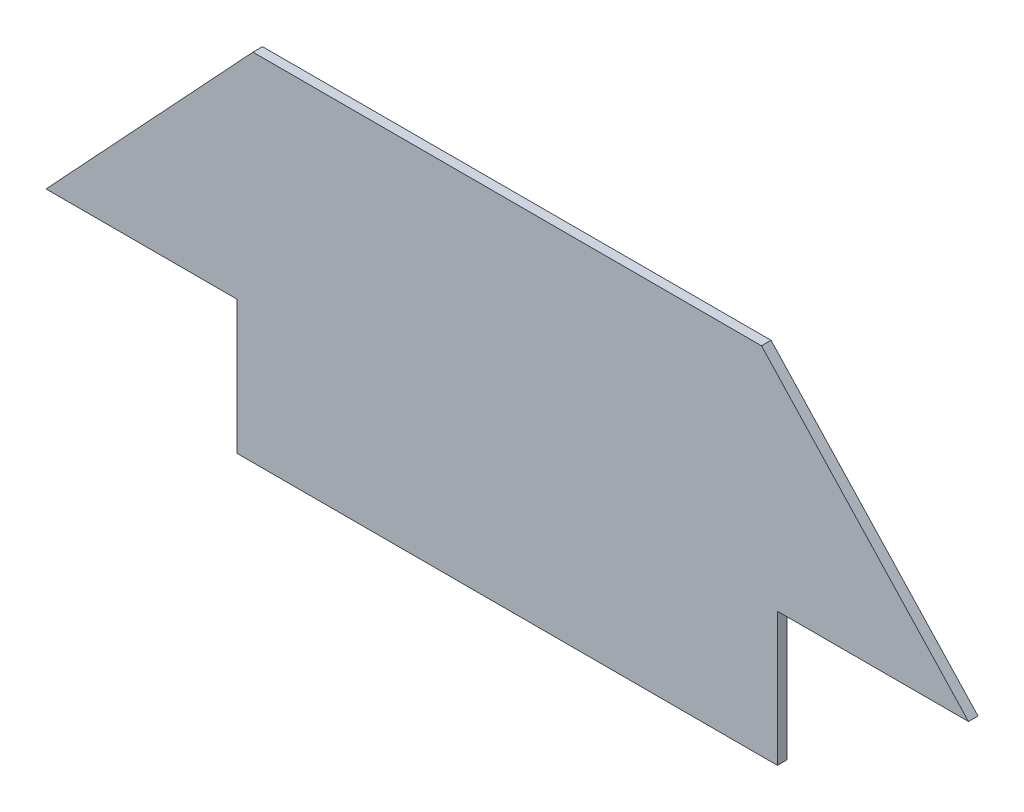
ISO-10303-21;
HEADER;
FILE_DESCRIPTION(('STEP AP214'),'2;1');
FILE_NAME('part.step','',(''),(''),'','','');
FILE_SCHEMA(('AUTOMOTIVE_DESIGN { 1 0 10303 214 1 1 1 1 }'));
ENDSEC;
DATA;
#1=APPLICATION_CONTEXT('core data for automotive mechanical design processes');
#2=APPLICATION_PROTOCOL_DEFINITION('international standard','automotive_design',2000,#1);
#3=PRODUCT_CONTEXT('',#1,'mechanical');
#4=PRODUCT('Part','Part','',(#3));
#5=PRODUCT_RELATED_PRODUCT_CATEGORY('part','',(#4));
#6=PRODUCT_DEFINITION_FORMATION('','',#4);
#7=PRODUCT_DEFINITION_CONTEXT('part definition',#1,'design');
#8=PRODUCT_DEFINITION('design','',#6,#7);
#9=PRODUCT_DEFINITION_SHAPE('','',#8);
#10=(LENGTH_UNIT() NAMED_UNIT(*) SI_UNIT(.MILLI.,.METRE.));
#11=(NAMED_UNIT(*) PLANE_ANGLE_UNIT() SI_UNIT($,.RADIAN.));
#12=(NAMED_UNIT(*) SI_UNIT($,.STERADIAN.) SOLID_ANGLE_UNIT());
#13=UNCERTAINTY_MEASURE_WITH_UNIT(LENGTH_MEASURE(1.E-05),#10,'distance_accuracy_value','');
#14=(GEOMETRIC_REPRESENTATION_CONTEXT(3) GLOBAL_UNCERTAINTY_ASSIGNED_CONTEXT((#13)) GLOBAL_UNIT_ASSIGNED_CONTEXT((#10,
#11,#12)) REPRESENTATION_CONTEXT('',''));
#15=CARTESIAN_POINT('',(0.,0.,0.));
#16=DIRECTION('',(0.,0.,1.));
#17=DIRECTION('',(1.,0.,0.));
#18=AXIS2_PLACEMENT_3D('',#15,#16,#17);
#19=CARTESIAN_POINT('',(0.,0.,3.));
#20=DIRECTION('',(0.,1.,0.));
#21=DIRECTION('',(0.,0.,1.));
#22=AXIS2_PLACEMENT_3D('',#19,#20,#21);
#23=PLANE('',#22);
#24=DIRECTION('',(1.,0.,0.));
#25=VECTOR('',#24,1.);
#26=CARTESIAN_POINT('',(0.,0.,0.));
#27=LINE('',#26,#25);
#28=CARTESIAN_POINT('',(-80.,0.,0.));
#29=VERTEX_POINT('',#28);
#30=CARTESIAN_POINT('',(80.,0.,0.));
#31=VERTEX_POINT('',#30);
#32=EDGE_CURVE('E143',#29,#31,#27,.T.);
#33=ORIENTED_EDGE('',*,*,#32,.F.);
#34=DIRECTION('',(0.,0.,-1.));
#35=VECTOR('',#34,1.);
#36=CARTESIAN_POINT('',(-80.,0.,3.));
#37=LINE('',#36,#35);
#38=CARTESIAN_POINT('',(-80.,0.,3.));
#39=VERTEX_POINT('',#38);
#40=EDGE_CURVE('E11',#39,#29,#37,.T.);
#41=ORIENTED_EDGE('',*,*,#40,.F.);
#42=DIRECTION('',(1.,0.,0.));
#43=VECTOR('',#42,1.);
#44=CARTESIAN_POINT('',(0.,0.,3.));
#45=LINE('',#44,#43);
#46=CARTESIAN_POINT('',(80.,0.,3.));
#47=VERTEX_POINT('',#46);
#48=EDGE_CURVE('E169',#39,#47,#45,.T.);
#49=ORIENTED_EDGE('',*,*,#48,.T.);
#50=DIRECTION('',(0.,0.,-1.));
#51=VECTOR('',#50,1.);
#52=CARTESIAN_POINT('',(80.,0.,3.));
#53=LINE('',#52,#51);
#54=EDGE_CURVE('E62',#47,#31,#53,.T.);
#55=ORIENTED_EDGE('',*,*,#54,.T.);
#56=EDGE_LOOP('',(#33,#41,#49,#55));
#57=FACE_BOUND('',#56,.T.);
#58=ADVANCED_FACE('F45',(#57),#23,.T.);
#59=CARTESIAN_POINT('',(-42.7902589497652,39.902562010393,3.));
#60=DIRECTION('',(0.731353701619172,-0.681998360062497,0.));
#61=DIRECTION('',(0.681998360062497,0.731353701619172,0.));
#62=AXIS2_PLACEMENT_3D('',#59,#60,#61);
#63=PLANE('',#62);
#64=DIRECTION('',(-0.681998360062497,-0.731353701619172,0.));
#65=VECTOR('',#64,1.);
#66=CARTESIAN_POINT('',(-42.7902589497652,39.902562010393,0.));
#67=LINE('',#66,#65);
#68=CARTESIAN_POINT('',(-145.109322536311,-69.8212002188447,0.));
#69=VERTEX_POINT('',#68);
#70=EDGE_CURVE('E146',#29,#69,#67,.T.);
#71=ORIENTED_EDGE('',*,*,#70,.T.);
#72=DIRECTION('',(0.,0.,-1.));
#73=VECTOR('',#72,1.);
#74=CARTESIAN_POINT('',(-145.109322536311,-69.8212002188447,3.));
#75=LINE('',#74,#73);
#76=CARTESIAN_POINT('',(-145.109322536311,-69.8212002188447,3.));
#77=VERTEX_POINT('',#76);
#78=EDGE_CURVE('E54',#77,#69,#75,.T.);
#79=ORIENTED_EDGE('',*,*,#78,.F.);
#80=DIRECTION('',(-0.681998360062497,-0.731353701619172,0.));
#81=VECTOR('',#80,1.);
#82=CARTESIAN_POINT('',(-42.7902589497652,39.902562010393,3.));
#83=LINE('',#82,#81);
#84=EDGE_CURVE('E206',#39,#77,#83,.T.);
#85=ORIENTED_EDGE('',*,*,#84,.F.);
#86=ORIENTED_EDGE('',*,*,#40,.T.);
#87=EDGE_LOOP('',(#71,#79,#85,#86));
#88=FACE_BOUND('',#87,.T.);
#89=ADVANCED_FACE('F223',(#88),#63,.F.);
#90=CARTESIAN_POINT('',(0.,-69.8212002188447,3.));
#91=DIRECTION('',(0.,1.,0.));
#92=DIRECTION('',(0.,0.,1.));
#93=AXIS2_PLACEMENT_3D('',#90,#91,#92);
#94=PLANE('',#93);
#95=DIRECTION('',(1.,0.,0.));
#96=VECTOR('',#95,1.);
#97=CARTESIAN_POINT('',(0.,-69.8212002188447,0.));
#98=LINE('',#97,#96);
#99=CARTESIAN_POINT('',(-85.,-69.8212002188447,0.));
#100=VERTEX_POINT('',#99);
#101=EDGE_CURVE('E149',#69,#100,#98,.T.);
#102=ORIENTED_EDGE('',*,*,#101,.T.);
#103=DIRECTION('',(0.,0.,-1.));
#104=VECTOR('',#103,1.);
#105=CARTESIAN_POINT('',(-85.,-69.8212002188447,3.));
#106=LINE('',#105,#104);
#107=CARTESIAN_POINT('',(-85.,-69.8212002188447,3.));
#108=VERTEX_POINT('',#107);
#109=EDGE_CURVE('E179',#108,#100,#106,.T.);
#110=ORIENTED_EDGE('',*,*,#109,.F.);
#111=DIRECTION('',(1.,0.,0.));
#112=VECTOR('',#111,1.);
#113=CARTESIAN_POINT('',(0.,-69.8212002188447,3.));
#114=LINE('',#113,#112);
#115=EDGE_CURVE('E190',#77,#108,#114,.T.);
#116=ORIENTED_EDGE('',*,*,#115,.F.);
#117=ORIENTED_EDGE('',*,*,#78,.T.);
#118=EDGE_LOOP('',(#102,#110,#116,#117));
#119=FACE_BOUND('',#118,.T.);
#120=ADVANCED_FACE('F188',(#119),#94,.F.);
#121=CARTESIAN_POINT('',(-85.,0.,3.));
#122=DIRECTION('',(1.,0.,0.));
#123=DIRECTION('',(0.,0.,-1.));
#124=AXIS2_PLACEMENT_3D('',#121,#122,#123);
#125=PLANE('',#124);
#126=DIRECTION('',(0.,-1.,0.));
#127=VECTOR('',#126,1.);
#128=CARTESIAN_POINT('',(-85.,0.,0.));
#129=LINE('',#128,#127);
#130=CARTESIAN_POINT('',(-85.,-111.821200218845,0.));
#131=VERTEX_POINT('',#130);
#132=EDGE_CURVE('E152',#100,#131,#129,.T.);
#133=ORIENTED_EDGE('',*,*,#132,.T.);
#134=DIRECTION('',(0.,0.,-1.));
#135=VECTOR('',#134,1.);
#136=CARTESIAN_POINT('',(-85.,-111.821200218845,3.));
#137=LINE('',#136,#135);
#138=CARTESIAN_POINT('',(-85.,-111.821200218845,3.));
#139=VERTEX_POINT('',#138);
#140=EDGE_CURVE('E176',#139,#131,#137,.T.);
#141=ORIENTED_EDGE('',*,*,#140,.F.);
#142=DIRECTION('',(0.,-1.,0.));
#143=VECTOR('',#142,1.);
#144=CARTESIAN_POINT('',(-85.,0.,3.));
#145=LINE('',#144,#143);
#146=EDGE_CURVE('E201',#108,#139,#145,.T.);
#147=ORIENTED_EDGE('',*,*,#146,.F.);
#148=ORIENTED_EDGE('',*,*,#109,.T.);
#149=EDGE_LOOP('',(#133,#141,#147,#148));
#150=FACE_BOUND('',#149,.T.);
#151=ADVANCED_FACE('F199',(#150),#125,.F.);
#152=CARTESIAN_POINT('',(0.,-111.821200218845,3.));
#153=DIRECTION('',(0.,-1.,0.));
#154=DIRECTION('',(0.,0.,-1.));
#155=AXIS2_PLACEMENT_3D('',#152,#153,#154);
#156=PLANE('',#155);
#157=DIRECTION('',(-1.,0.,0.));
#158=VECTOR('',#157,1.);
#159=CARTESIAN_POINT('',(0.,-111.821200218845,0.));
#160=LINE('',#159,#158);
#161=CARTESIAN_POINT('',(85.,-111.821200218845,0.));
#162=VERTEX_POINT('',#161);
#163=EDGE_CURVE('E156',#162,#131,#160,.T.);
#164=ORIENTED_EDGE('',*,*,#163,.F.);
#165=DIRECTION('',(0.,0.,-1.));
#166=VECTOR('',#165,1.);
#167=CARTESIAN_POINT('',(85.,-111.821200218845,3.));
#168=LINE('',#167,#166);
#169=CARTESIAN_POINT('',(85.,-111.821200218845,3.));
#170=VERTEX_POINT('',#169);
#171=EDGE_CURVE('E122',#170,#162,#168,.T.);
#172=ORIENTED_EDGE('',*,*,#171,.F.);
#173=DIRECTION('',(-1.,0.,0.));
#174=VECTOR('',#173,1.);
#175=CARTESIAN_POINT('',(0.,-111.821200218845,3.));
#176=LINE('',#175,#174);
#177=EDGE_CURVE('E132',#170,#139,#176,.T.);
#178=ORIENTED_EDGE('',*,*,#177,.T.);
#179=ORIENTED_EDGE('',*,*,#140,.T.);
#180=EDGE_LOOP('',(#164,#172,#178,#179));
#181=FACE_BOUND('',#180,.T.);
#182=ADVANCED_FACE('F234',(#181),#156,.T.);
#183=CARTESIAN_POINT('',(85.,0.,3.));
#184=DIRECTION('',(1.,0.,0.));
#185=DIRECTION('',(0.,0.,-1.));
#186=AXIS2_PLACEMENT_3D('',#183,#184,#185);
#187=PLANE('',#186);
#188=DIRECTION('',(0.,-1.,0.));
#189=VECTOR('',#188,1.);
#190=CARTESIAN_POINT('',(85.,0.,0.));
#191=LINE('',#190,#189);
#192=CARTESIAN_POINT('',(85.,-69.8212002188447,0.));
#193=VERTEX_POINT('',#192);
#194=EDGE_CURVE('E117',#193,#162,#191,.T.);
#195=ORIENTED_EDGE('',*,*,#194,.F.);
#196=DIRECTION('',(0.,0.,-1.));
#197=VECTOR('',#196,1.);
#198=CARTESIAN_POINT('',(85.,-69.8212002188447,3.));
#199=LINE('',#198,#197);
#200=CARTESIAN_POINT('',(85.,-69.8212002188447,3.));
#201=VERTEX_POINT('',#200);
#202=EDGE_CURVE('E112',#201,#193,#199,.T.);
#203=ORIENTED_EDGE('',*,*,#202,.F.);
#204=DIRECTION('',(0.,-1.,0.));
#205=VECTOR('',#204,1.);
#206=CARTESIAN_POINT('',(85.,0.,3.));
#207=LINE('',#206,#205);
#208=EDGE_CURVE('E115',#201,#170,#207,.T.);
#209=ORIENTED_EDGE('',*,*,#208,.T.);
#210=ORIENTED_EDGE('',*,*,#171,.T.);
#211=EDGE_LOOP('',(#195,#203,#209,#210));
#212=FACE_BOUND('',#211,.T.);
#213=ADVANCED_FACE('F114',(#212),#187,.T.);
#214=CARTESIAN_POINT('',(0.,-69.8212002188447,3.));
#215=DIRECTION('',(0.,-1.,0.));
#216=DIRECTION('',(0.,0.,-1.));
#217=AXIS2_PLACEMENT_3D('',#214,#215,#216);
#218=PLANE('',#217);
#219=DIRECTION('',(-1.,0.,0.));
#220=VECTOR('',#219,1.);
#221=CARTESIAN_POINT('',(0.,-69.8212002188447,0.));
#222=LINE('',#221,#220);
#223=CARTESIAN_POINT('',(145.109322536311,-69.8212002188447,0.));
#224=VERTEX_POINT('',#223);
#225=EDGE_CURVE('E162',#224,#193,#222,.T.);
#226=ORIENTED_EDGE('',*,*,#225,.F.);
#227=DIRECTION('',(0.,0.,-1.));
#228=VECTOR('',#227,1.);
#229=CARTESIAN_POINT('',(145.109322536311,-69.8212002188447,3.));
#230=LINE('',#229,#228);
#231=CARTESIAN_POINT('',(145.109322536311,-69.8212002188447,3.));
#232=VERTEX_POINT('',#231);
#233=EDGE_CURVE('E87',#232,#224,#230,.T.);
#234=ORIENTED_EDGE('',*,*,#233,.F.);
#235=DIRECTION('',(-1.,0.,0.));
#236=VECTOR('',#235,1.);
#237=CARTESIAN_POINT('',(0.,-69.8212002188447,3.));
#238=LINE('',#237,#236);
#239=EDGE_CURVE('E130',#232,#201,#238,.T.);
#240=ORIENTED_EDGE('',*,*,#239,.T.);
#241=ORIENTED_EDGE('',*,*,#202,.T.);
#242=EDGE_LOOP('',(#226,#234,#240,#241));
#243=FACE_BOUND('',#242,.T.);
#244=ADVANCED_FACE('F135',(#243),#218,.T.);
#245=CARTESIAN_POINT('',(42.7902589497652,39.902562010393,3.));
#246=DIRECTION('',(0.731353701619172,0.681998360062497,0.));
#247=DIRECTION('',(-0.681998360062497,0.731353701619172,0.));
#248=AXIS2_PLACEMENT_3D('',#245,#246,#247);
#249=PLANE('',#248);
#250=DIRECTION('',(0.681998360062497,-0.731353701619172,0.));
#251=VECTOR('',#250,1.);
#252=CARTESIAN_POINT('',(42.7902589497652,39.902562010393,0.));
#253=LINE('',#252,#251);
#254=EDGE_CURVE('E165',#31,#224,#253,.T.);
#255=ORIENTED_EDGE('',*,*,#254,.F.);
#256=ORIENTED_EDGE('',*,*,#54,.F.);
#257=DIRECTION('',(0.681998360062497,-0.731353701619172,0.));
#258=VECTOR('',#257,1.);
#259=CARTESIAN_POINT('',(42.7902589497652,39.902562010393,3.));
#260=LINE('',#259,#258);
#261=EDGE_CURVE('E137',#47,#232,#260,.T.);
#262=ORIENTED_EDGE('',*,*,#261,.T.);
#263=ORIENTED_EDGE('',*,*,#233,.T.);
#264=EDGE_LOOP('',(#255,#256,#262,#263));
#265=FACE_BOUND('',#264,.T.);
#266=ADVANCED_FACE('F212',(#265),#249,.T.);
#267=CARTESIAN_POINT('',(0.,0.,3.));
#268=DIRECTION('',(0.,0.,1.));
#269=DIRECTION('',(1.,0.,0.));
#270=AXIS2_PLACEMENT_3D('',#267,#268,#269);
#271=PLANE('',#270);
#272=ORIENTED_EDGE('',*,*,#48,.F.);
#273=ORIENTED_EDGE('',*,*,#84,.T.);
#274=ORIENTED_EDGE('',*,*,#115,.T.);
#275=ORIENTED_EDGE('',*,*,#146,.T.);
#276=ORIENTED_EDGE('',*,*,#177,.F.);
#277=ORIENTED_EDGE('',*,*,#208,.F.);
#278=ORIENTED_EDGE('',*,*,#239,.F.);
#279=ORIENTED_EDGE('',*,*,#261,.F.);
#280=EDGE_LOOP('',(#272,#273,#274,#275,#276,#277,#278,#279));
#281=FACE_BOUND('',#280,.T.);
#282=ADVANCED_FACE('F128',(#281),#271,.T.);
#283=CARTESIAN_POINT('',(0.,0.,0.));
#284=DIRECTION('',(0.,0.,1.));
#285=DIRECTION('',(1.,0.,0.));
#286=AXIS2_PLACEMENT_3D('',#283,#284,#285);
#287=PLANE('',#286);
#288=ORIENTED_EDGE('',*,*,#32,.T.);
#289=ORIENTED_EDGE('',*,*,#254,.T.);
#290=ORIENTED_EDGE('',*,*,#225,.T.);
#291=ORIENTED_EDGE('',*,*,#194,.T.);
#292=ORIENTED_EDGE('',*,*,#163,.T.);
#293=ORIENTED_EDGE('',*,*,#132,.F.);
#294=ORIENTED_EDGE('',*,*,#101,.F.);
#295=ORIENTED_EDGE('',*,*,#70,.F.);
#296=EDGE_LOOP('',(#288,#289,#290,#291,#292,#293,#294,#295));
#297=FACE_BOUND('',#296,.T.);
#298=ADVANCED_FACE('F195',(#297),#287,.F.);
#299=CLOSED_SHELL('',(#58,#89,#120,#151,#182,#213,#244,#266,#282,#298));
#300=MANIFOLD_SOLID_BREP('B2',#299);
#301=ADVANCED_BREP_SHAPE_REPRESENTATION('',(#18,#300),#14);
#302=SHAPE_DEFINITION_REPRESENTATION(#9,#301);
ENDSEC;
END-ISO-10303-21;
